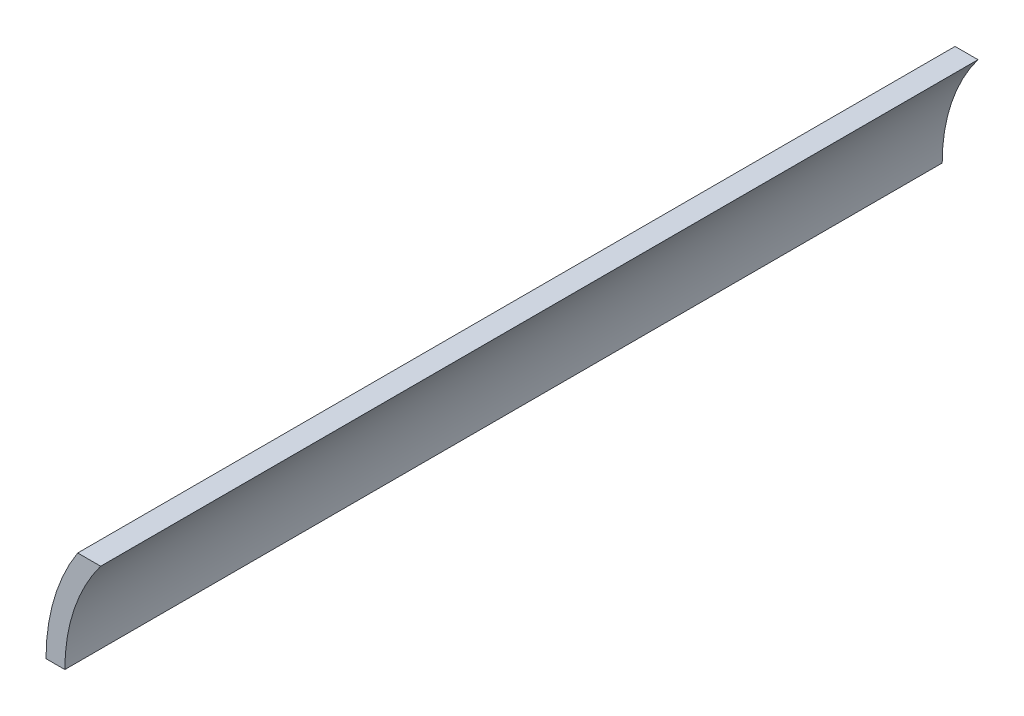
ISO-10303-21;
HEADER;
FILE_DESCRIPTION(('STEP AP214'),'2;1');
FILE_NAME('part.step','',(''),(''),'','','');
FILE_SCHEMA(('AUTOMOTIVE_DESIGN { 1 0 10303 214 1 1 1 1 }'));
ENDSEC;
DATA;
#1=APPLICATION_CONTEXT('core data for automotive mechanical design processes');
#2=APPLICATION_PROTOCOL_DEFINITION('international standard','automotive_design',2000,#1);
#3=PRODUCT_CONTEXT('',#1,'mechanical');
#4=PRODUCT('Part','Part','',(#3));
#5=PRODUCT_RELATED_PRODUCT_CATEGORY('part','',(#4));
#6=PRODUCT_DEFINITION_FORMATION('','',#4);
#7=PRODUCT_DEFINITION_CONTEXT('part definition',#1,'design');
#8=PRODUCT_DEFINITION('design','',#6,#7);
#9=PRODUCT_DEFINITION_SHAPE('','',#8);
#10=(LENGTH_UNIT() NAMED_UNIT(*) SI_UNIT(.MILLI.,.METRE.));
#11=(NAMED_UNIT(*) PLANE_ANGLE_UNIT() SI_UNIT($,.RADIAN.));
#12=(NAMED_UNIT(*) SI_UNIT($,.STERADIAN.) SOLID_ANGLE_UNIT());
#13=UNCERTAINTY_MEASURE_WITH_UNIT(LENGTH_MEASURE(1.E-05),#10,'distance_accuracy_value','');
#14=(GEOMETRIC_REPRESENTATION_CONTEXT(3) GLOBAL_UNCERTAINTY_ASSIGNED_CONTEXT((#13)) GLOBAL_UNIT_ASSIGNED_CONTEXT((#10,
#11,#12)) REPRESENTATION_CONTEXT('',''));
#15=CARTESIAN_POINT('',(0.,0.,0.));
#16=DIRECTION('',(0.,0.,1.));
#17=DIRECTION('',(1.,0.,0.));
#18=AXIS2_PLACEMENT_3D('',#15,#16,#17);
#19=CARTESIAN_POINT('',(0.,0.,245.));
#20=DIRECTION('',(0.,0.,-1.));
#21=DIRECTION('',(-1.,0.,0.));
#22=AXIS2_PLACEMENT_3D('',#19,#20,#21);
#23=CYLINDRICAL_SURFACE('',#22,50.);
#24=CARTESIAN_POINT('',(0.,0.,0.));
#25=DIRECTION('',(0.,0.,-1.));
#26=DIRECTION('',(-1.,0.,0.));
#27=AXIS2_PLACEMENT_3D('',#24,#25,#26);
#28=CIRCLE('',#27,50.);
#29=CARTESIAN_POINT('',(-50.,0.,0.));
#30=VERTEX_POINT('',#29);
#31=CARTESIAN_POINT('',(-40.,30.,0.));
#32=VERTEX_POINT('',#31);
#33=EDGE_CURVE('E95',#30,#32,#28,.T.);
#34=ORIENTED_EDGE('',*,*,#33,.T.);
#35=DIRECTION('',(0.,0.,-1.));
#36=VECTOR('',#35,1.);
#37=CARTESIAN_POINT('',(-40.,30.,245.));
#38=LINE('',#37,#36);
#39=CARTESIAN_POINT('',(-40.,30.,245.));
#40=VERTEX_POINT('',#39);
#41=EDGE_CURVE('E11',#40,#32,#38,.T.);
#42=ORIENTED_EDGE('',*,*,#41,.F.);
#43=CARTESIAN_POINT('',(0.,0.,245.));
#44=DIRECTION('',(0.,0.,-1.));
#45=DIRECTION('',(-1.,0.,0.));
#46=AXIS2_PLACEMENT_3D('',#43,#44,#45);
#47=CIRCLE('',#46,50.);
#48=CARTESIAN_POINT('',(-50.,0.,245.));
#49=VERTEX_POINT('',#48);
#50=EDGE_CURVE('E83',#49,#40,#47,.T.);
#51=ORIENTED_EDGE('',*,*,#50,.F.);
#52=DIRECTION('',(0.,0.,-1.));
#53=VECTOR('',#52,1.);
#54=CARTESIAN_POINT('',(-50.,0.,245.));
#55=LINE('',#54,#53);
#56=EDGE_CURVE('E91',#49,#30,#55,.T.);
#57=ORIENTED_EDGE('',*,*,#56,.T.);
#58=EDGE_LOOP('',(#34,#42,#51,#57));
#59=FACE_BOUND('',#58,.T.);
#60=ADVANCED_FACE('F32',(#59),#23,.F.);
#61=CARTESIAN_POINT('',(-46.4068068096293,30.,245.));
#62=DIRECTION('',(0.,-1.,0.));
#63=DIRECTION('',(0.,0.,-1.));
#64=AXIS2_PLACEMENT_3D('',#61,#62,#63);
#65=PLANE('',#64);
#66=DIRECTION('',(-1.,0.,0.));
#67=VECTOR('',#66,1.);
#68=CARTESIAN_POINT('',(-46.4068068096293,30.,0.));
#69=LINE('',#68,#67);
#70=CARTESIAN_POINT('',(-46.4068068096293,30.,0.));
#71=VERTEX_POINT('',#70);
#72=EDGE_CURVE('E87',#32,#71,#69,.T.);
#73=ORIENTED_EDGE('',*,*,#72,.T.);
#74=DIRECTION('',(0.,0.,-1.));
#75=VECTOR('',#74,1.);
#76=CARTESIAN_POINT('',(-46.4068068096293,30.,245.));
#77=LINE('',#76,#75);
#78=CARTESIAN_POINT('',(-46.4068068096293,30.,245.));
#79=VERTEX_POINT('',#78);
#80=EDGE_CURVE('E40',#79,#71,#77,.T.);
#81=ORIENTED_EDGE('',*,*,#80,.F.);
#82=DIRECTION('',(-1.,0.,0.));
#83=VECTOR('',#82,1.);
#84=CARTESIAN_POINT('',(-46.4068068096293,30.,245.));
#85=LINE('',#84,#83);
#86=EDGE_CURVE('E78',#40,#79,#85,.T.);
#87=ORIENTED_EDGE('',*,*,#86,.F.);
#88=ORIENTED_EDGE('',*,*,#41,.T.);
#89=EDGE_LOOP('',(#73,#81,#87,#88));
#90=FACE_BOUND('',#89,.T.);
#91=ADVANCED_FACE('F86',(#90),#65,.F.);
#92=CARTESIAN_POINT('',(0.,0.,245.));
#93=DIRECTION('',(0.,0.,-1.));
#94=DIRECTION('',(-1.,0.,0.));
#95=AXIS2_PLACEMENT_3D('',#92,#93,#94);
#96=CYLINDRICAL_SURFACE('',#95,55.2593134074814);
#97=CARTESIAN_POINT('',(0.,0.,0.));
#98=DIRECTION('',(0.,0.,1.));
#99=DIRECTION('',(-1.,0.,0.));
#100=AXIS2_PLACEMENT_3D('',#97,#98,#99);
#101=CIRCLE('',#100,55.2593134074814);
#102=CARTESIAN_POINT('',(-55.2593134074814,0.,0.));
#103=VERTEX_POINT('',#102);
#104=EDGE_CURVE('E65',#71,#103,#101,.T.);
#105=ORIENTED_EDGE('',*,*,#104,.T.);
#106=DIRECTION('',(0.,0.,-1.));
#107=VECTOR('',#106,1.);
#108=CARTESIAN_POINT('',(-55.2593134074814,0.,245.));
#109=LINE('',#108,#107);
#110=CARTESIAN_POINT('',(-55.2593134074814,0.,245.));
#111=VERTEX_POINT('',#110);
#112=EDGE_CURVE('E88',#111,#103,#109,.T.);
#113=ORIENTED_EDGE('',*,*,#112,.F.);
#114=CARTESIAN_POINT('',(0.,0.,245.));
#115=DIRECTION('',(0.,0.,1.));
#116=DIRECTION('',(-1.,0.,0.));
#117=AXIS2_PLACEMENT_3D('',#114,#115,#116);
#118=CIRCLE('',#117,55.2593134074814);
#119=EDGE_CURVE('E81',#79,#111,#118,.T.);
#120=ORIENTED_EDGE('',*,*,#119,.F.);
#121=ORIENTED_EDGE('',*,*,#80,.T.);
#122=EDGE_LOOP('',(#105,#113,#120,#121));
#123=FACE_BOUND('',#122,.T.);
#124=ADVANCED_FACE('F89',(#123),#96,.T.);
#125=CARTESIAN_POINT('',(-50.,0.,245.));
#126=DIRECTION('',(0.,1.,0.));
#127=DIRECTION('',(0.,0.,1.));
#128=AXIS2_PLACEMENT_3D('',#125,#126,#127);
#129=PLANE('',#128);
#130=DIRECTION('',(1.,0.,0.));
#131=VECTOR('',#130,1.);
#132=CARTESIAN_POINT('',(-50.,0.,0.));
#133=LINE('',#132,#131);
#134=EDGE_CURVE('E71',#103,#30,#133,.T.);
#135=ORIENTED_EDGE('',*,*,#134,.T.);
#136=ORIENTED_EDGE('',*,*,#56,.F.);
#137=DIRECTION('',(1.,0.,0.));
#138=VECTOR('',#137,1.);
#139=CARTESIAN_POINT('',(-50.,0.,245.));
#140=LINE('',#139,#138);
#141=EDGE_CURVE('E48',#111,#49,#140,.T.);
#142=ORIENTED_EDGE('',*,*,#141,.F.);
#143=ORIENTED_EDGE('',*,*,#112,.T.);
#144=EDGE_LOOP('',(#135,#136,#142,#143));
#145=FACE_BOUND('',#144,.T.);
#146=ADVANCED_FACE('F102',(#145),#129,.F.);
#147=CARTESIAN_POINT('',(0.,0.,245.));
#148=DIRECTION('',(0.,0.,-1.));
#149=DIRECTION('',(-1.,0.,0.));
#150=AXIS2_PLACEMENT_3D('',#147,#148,#149);
#151=PLANE('',#150);
#152=ORIENTED_EDGE('',*,*,#50,.T.);
#153=ORIENTED_EDGE('',*,*,#86,.T.);
#154=ORIENTED_EDGE('',*,*,#119,.T.);
#155=ORIENTED_EDGE('',*,*,#141,.T.);
#156=EDGE_LOOP('',(#152,#153,#154,#155));
#157=FACE_BOUND('',#156,.T.);
#158=ADVANCED_FACE('F79',(#157),#151,.F.);
#159=CARTESIAN_POINT('',(0.,0.,0.));
#160=DIRECTION('',(0.,0.,-1.));
#161=DIRECTION('',(-1.,0.,0.));
#162=AXIS2_PLACEMENT_3D('',#159,#160,#161);
#163=PLANE('',#162);
#164=ORIENTED_EDGE('',*,*,#33,.F.);
#165=ORIENTED_EDGE('',*,*,#134,.F.);
#166=ORIENTED_EDGE('',*,*,#104,.F.);
#167=ORIENTED_EDGE('',*,*,#72,.F.);
#168=EDGE_LOOP('',(#164,#165,#166,#167));
#169=FACE_BOUND('',#168,.T.);
#170=ADVANCED_FACE('F105',(#169),#163,.T.);
#171=CLOSED_SHELL('',(#60,#91,#124,#146,#158,#170));
#172=MANIFOLD_SOLID_BREP('B2',#171);
#173=ADVANCED_BREP_SHAPE_REPRESENTATION('',(#18,#172),#14);
#174=SHAPE_DEFINITION_REPRESENTATION(#9,#173);
ENDSEC;
END-ISO-10303-21;
